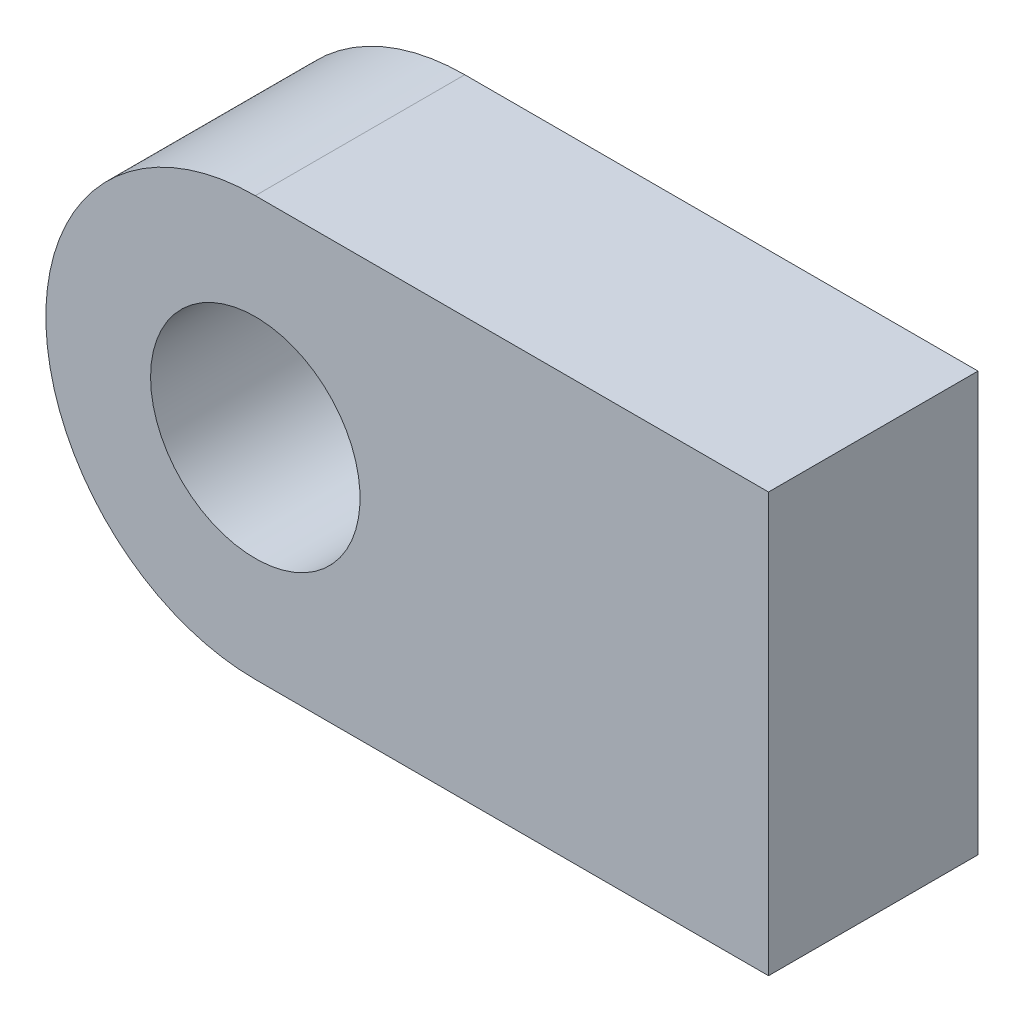
ISO-10303-21;
HEADER;
FILE_DESCRIPTION(('STEP AP214'),'2;1');
FILE_NAME('part.step','',(''),(''),'','','');
FILE_SCHEMA(('AUTOMOTIVE_DESIGN { 1 0 10303 214 1 1 1 1 }'));
ENDSEC;
DATA;
#1=APPLICATION_CONTEXT('core data for automotive mechanical design processes');
#2=APPLICATION_PROTOCOL_DEFINITION('international standard','automotive_design',2000,#1);
#3=PRODUCT_CONTEXT('',#1,'mechanical');
#4=PRODUCT('Part','Part','',(#3));
#5=PRODUCT_RELATED_PRODUCT_CATEGORY('part','',(#4));
#6=PRODUCT_DEFINITION_FORMATION('','',#4);
#7=PRODUCT_DEFINITION_CONTEXT('part definition',#1,'design');
#8=PRODUCT_DEFINITION('design','',#6,#7);
#9=PRODUCT_DEFINITION_SHAPE('','',#8);
#10=(LENGTH_UNIT() NAMED_UNIT(*) SI_UNIT(.MILLI.,.METRE.));
#11=(NAMED_UNIT(*) PLANE_ANGLE_UNIT() SI_UNIT($,.RADIAN.));
#12=(NAMED_UNIT(*) SI_UNIT($,.STERADIAN.) SOLID_ANGLE_UNIT());
#13=UNCERTAINTY_MEASURE_WITH_UNIT(LENGTH_MEASURE(1.E-05),#10,'distance_accuracy_value','');
#14=(GEOMETRIC_REPRESENTATION_CONTEXT(3) GLOBAL_UNCERTAINTY_ASSIGNED_CONTEXT((#13)) GLOBAL_UNIT_ASSIGNED_CONTEXT((#10,
#11,#12)) REPRESENTATION_CONTEXT('',''));
#15=CARTESIAN_POINT('',(0.,0.,0.));
#16=DIRECTION('',(0.,0.,1.));
#17=DIRECTION('',(1.,0.,0.));
#18=AXIS2_PLACEMENT_3D('',#15,#16,#17);
#19=CARTESIAN_POINT('',(0.,20.,0.));
#20=DIRECTION('',(0.,1.,0.));
#21=DIRECTION('',(0.,0.,1.));
#22=AXIS2_PLACEMENT_3D('',#19,#20,#21);
#23=PLANE('',#22);
#24=DIRECTION('',(-1.,0.,0.));
#25=VECTOR('',#24,1.);
#26=CARTESIAN_POINT('',(34.5,20.,-5.00000000000001));
#27=LINE('',#26,#25);
#28=CARTESIAN_POINT('',(34.5,20.,-5.00000000000001));
#29=VERTEX_POINT('',#28);
#30=CARTESIAN_POINT('',(9.99999999999999,20.,-4.99999999999999));
#31=VERTEX_POINT('',#30);
#32=EDGE_CURVE('E92',#29,#31,#27,.T.);
#33=ORIENTED_EDGE('',*,*,#32,.T.);
#34=DIRECTION('',(0.,0.,-1.));
#35=VECTOR('',#34,1.);
#36=CARTESIAN_POINT('',(9.99999999999999,20.,21.));
#37=LINE('',#36,#35);
#38=CARTESIAN_POINT('',(9.99999999999999,20.,4.99999999999999));
#39=VERTEX_POINT('',#38);
#40=EDGE_CURVE('E113',#39,#31,#37,.T.);
#41=ORIENTED_EDGE('',*,*,#40,.F.);
#42=DIRECTION('',(1.,0.,0.));
#43=VECTOR('',#42,1.);
#44=CARTESIAN_POINT('',(0.,20.,4.99999999999999));
#45=LINE('',#44,#43);
#46=CARTESIAN_POINT('',(34.5,20.,4.99999999999999));
#47=VERTEX_POINT('',#46);
#48=EDGE_CURVE('E97',#39,#47,#45,.T.);
#49=ORIENTED_EDGE('',*,*,#48,.T.);
#50=DIRECTION('',(0.,0.,-1.));
#51=VECTOR('',#50,1.);
#52=CARTESIAN_POINT('',(34.5,20.,4.99999999999999));
#53=LINE('',#52,#51);
#54=EDGE_CURVE('E63',#47,#29,#53,.T.);
#55=ORIENTED_EDGE('',*,*,#54,.T.);
#56=EDGE_LOOP('',(#33,#41,#49,#55));
#57=FACE_BOUND('',#56,.T.);
#58=ADVANCED_FACE('F39',(#57),#23,.T.);
#59=CARTESIAN_POINT('',(0.,0.,0.));
#60=DIRECTION('',(0.,1.,0.));
#61=DIRECTION('',(0.,0.,1.));
#62=AXIS2_PLACEMENT_3D('',#59,#60,#61);
#63=PLANE('',#62);
#64=DIRECTION('',(0.,0.,-1.));
#65=VECTOR('',#64,1.);
#66=CARTESIAN_POINT('',(10.,0.,21.));
#67=LINE('',#66,#65);
#68=CARTESIAN_POINT('',(9.99999999999999,0.,-5.));
#69=VERTEX_POINT('',#68);
#70=CARTESIAN_POINT('',(10.,0.,4.99999999999999));
#71=VERTEX_POINT('',#70);
#72=EDGE_CURVE('E11',#69,#71,#67,.F.);
#73=ORIENTED_EDGE('',*,*,#72,.F.);
#74=DIRECTION('',(-1.,0.,0.));
#75=VECTOR('',#74,1.);
#76=CARTESIAN_POINT('',(34.5,0.,-5.00000000000001));
#77=LINE('',#76,#75);
#78=CARTESIAN_POINT('',(34.5,0.,-5.00000000000001));
#79=VERTEX_POINT('',#78);
#80=EDGE_CURVE('E86',#79,#69,#77,.T.);
#81=ORIENTED_EDGE('',*,*,#80,.F.);
#82=DIRECTION('',(0.,0.,-1.));
#83=VECTOR('',#82,1.);
#84=CARTESIAN_POINT('',(34.5,0.,4.99999999999999));
#85=LINE('',#84,#83);
#86=CARTESIAN_POINT('',(34.5,0.,4.99999999999999));
#87=VERTEX_POINT('',#86);
#88=EDGE_CURVE('E76',#87,#79,#85,.T.);
#89=ORIENTED_EDGE('',*,*,#88,.F.);
#90=DIRECTION('',(1.,0.,0.));
#91=VECTOR('',#90,1.);
#92=CARTESIAN_POINT('',(0.,0.,4.99999999999999));
#93=LINE('',#92,#91);
#94=EDGE_CURVE('E87',#71,#87,#93,.T.);
#95=ORIENTED_EDGE('',*,*,#94,.F.);
#96=EDGE_LOOP('',(#73,#81,#89,#95));
#97=FACE_BOUND('',#96,.T.);
#98=ADVANCED_FACE('F95',(#97),#63,.F.);
#99=CARTESIAN_POINT('',(0.,20.,4.99999999999999));
#100=DIRECTION('',(0.,0.,-1.));
#101=DIRECTION('',(-1.,0.,0.));
#102=AXIS2_PLACEMENT_3D('',#99,#100,#101);
#103=PLANE('',#102);
#104=CARTESIAN_POINT('',(10.,10.,4.99999999999999));
#105=DIRECTION('',(0.,0.,-1.));
#106=DIRECTION('',(-1.,0.,0.));
#107=AXIS2_PLACEMENT_3D('',#104,#105,#106);
#108=CIRCLE('',#107,5.);
#109=CARTESIAN_POINT('',(5.,10.,4.99999999999999));
#110=VERTEX_POINT('',#109);
#111=EDGE_CURVE('E121',#110,#110,#108,.T.);
#112=ORIENTED_EDGE('',*,*,#111,.T.);
#113=EDGE_LOOP('',(#112));
#114=FACE_BOUND('',#113,.T.);
#115=ORIENTED_EDGE('',*,*,#48,.F.);
#116=CARTESIAN_POINT('',(10.,10.,4.99999999999999));
#117=DIRECTION('',(0.,0.,-1.));
#118=DIRECTION('',(-1.,0.,0.));
#119=AXIS2_PLACEMENT_3D('',#116,#117,#118);
#120=CIRCLE('',#119,10.);
#121=EDGE_CURVE('E109',#39,#71,#120,.F.);
#122=ORIENTED_EDGE('',*,*,#121,.T.);
#123=ORIENTED_EDGE('',*,*,#94,.T.);
#124=DIRECTION('',(0.,-1.,0.));
#125=VECTOR('',#124,1.);
#126=CARTESIAN_POINT('',(34.5,20.,4.99999999999999));
#127=LINE('',#126,#125);
#128=EDGE_CURVE('E48',#47,#87,#127,.T.);
#129=ORIENTED_EDGE('',*,*,#128,.F.);
#130=EDGE_LOOP('',(#115,#122,#123,#129));
#131=FACE_BOUND('',#130,.T.);
#132=ADVANCED_FACE('F41',(#114,#131),#103,.F.);
#133=CARTESIAN_POINT('',(34.5,20.,4.99999999999999));
#134=DIRECTION('',(-1.,0.,0.));
#135=DIRECTION('',(0.,0.,1.));
#136=AXIS2_PLACEMENT_3D('',#133,#134,#135);
#137=PLANE('',#136);
#138=ORIENTED_EDGE('',*,*,#88,.T.);
#139=DIRECTION('',(0.,-1.,0.));
#140=VECTOR('',#139,1.);
#141=CARTESIAN_POINT('',(34.5,20.,-5.00000000000001));
#142=LINE('',#141,#140);
#143=EDGE_CURVE('E79',#29,#79,#142,.T.);
#144=ORIENTED_EDGE('',*,*,#143,.F.);
#145=ORIENTED_EDGE('',*,*,#54,.F.);
#146=ORIENTED_EDGE('',*,*,#128,.T.);
#147=EDGE_LOOP('',(#138,#144,#145,#146));
#148=FACE_BOUND('',#147,.T.);
#149=ADVANCED_FACE('F78',(#148),#137,.F.);
#150=CARTESIAN_POINT('',(34.5,20.,-5.00000000000001));
#151=DIRECTION('',(0.,0.,1.));
#152=DIRECTION('',(1.,0.,0.));
#153=AXIS2_PLACEMENT_3D('',#150,#151,#152);
#154=PLANE('',#153);
#155=CARTESIAN_POINT('',(10.,10.,-4.99999999999999));
#156=DIRECTION('',(0.,0.,-1.));
#157=DIRECTION('',(-1.,0.,0.));
#158=AXIS2_PLACEMENT_3D('',#155,#156,#157);
#159=CIRCLE('',#158,5.);
#160=CARTESIAN_POINT('',(5.,10.,-4.99999999999999));
#161=VERTEX_POINT('',#160);
#162=EDGE_CURVE('E125',#161,#161,#159,.T.);
#163=ORIENTED_EDGE('',*,*,#162,.F.);
#164=EDGE_LOOP('',(#163));
#165=FACE_BOUND('',#164,.T.);
#166=ORIENTED_EDGE('',*,*,#80,.T.);
#167=CARTESIAN_POINT('',(10.,10.,-4.99999999999999));
#168=DIRECTION('',(0.,0.,1.));
#169=DIRECTION('',(1.,0.,0.));
#170=AXIS2_PLACEMENT_3D('',#167,#168,#169);
#171=CIRCLE('',#170,10.);
#172=EDGE_CURVE('E54',#31,#69,#171,.T.);
#173=ORIENTED_EDGE('',*,*,#172,.F.);
#174=ORIENTED_EDGE('',*,*,#32,.F.);
#175=ORIENTED_EDGE('',*,*,#143,.T.);
#176=EDGE_LOOP('',(#166,#173,#174,#175));
#177=FACE_BOUND('',#176,.T.);
#178=ADVANCED_FACE('F91',(#165,#177),#154,.F.);
#179=CARTESIAN_POINT('',(10.,10.,21.));
#180=DIRECTION('',(0.,0.,-1.));
#181=DIRECTION('',(-1.,0.,0.));
#182=AXIS2_PLACEMENT_3D('',#179,#180,#181);
#183=CYLINDRICAL_SURFACE('',#182,10.);
#184=ORIENTED_EDGE('',*,*,#172,.T.);
#185=ORIENTED_EDGE('',*,*,#72,.T.);
#186=ORIENTED_EDGE('',*,*,#121,.F.);
#187=ORIENTED_EDGE('',*,*,#40,.T.);
#188=EDGE_LOOP('',(#184,#185,#186,#187));
#189=FACE_BOUND('',#188,.T.);
#190=ADVANCED_FACE('F134',(#189),#183,.T.);
#191=CARTESIAN_POINT('',(10.,10.,21.));
#192=DIRECTION('',(0.,0.,-1.));
#193=DIRECTION('',(-1.,0.,0.));
#194=AXIS2_PLACEMENT_3D('',#191,#192,#193);
#195=CYLINDRICAL_SURFACE('',#194,5.);
#196=ORIENTED_EDGE('',*,*,#162,.T.);
#197=EDGE_LOOP('',(#196));
#198=FACE_BOUND('',#197,.T.);
#199=ORIENTED_EDGE('',*,*,#111,.F.);
#200=EDGE_LOOP('',(#199));
#201=FACE_BOUND('',#200,.T.);
#202=ADVANCED_FACE('F130',(#198,#201),#195,.F.);
#203=CLOSED_SHELL('',(#58,#98,#132,#149,#178,#190,#202));
#204=MANIFOLD_SOLID_BREP('B2',#203);
#205=ADVANCED_BREP_SHAPE_REPRESENTATION('',(#18,#204),#14);
#206=SHAPE_DEFINITION_REPRESENTATION(#9,#205);
ENDSEC;
END-ISO-10303-21;
